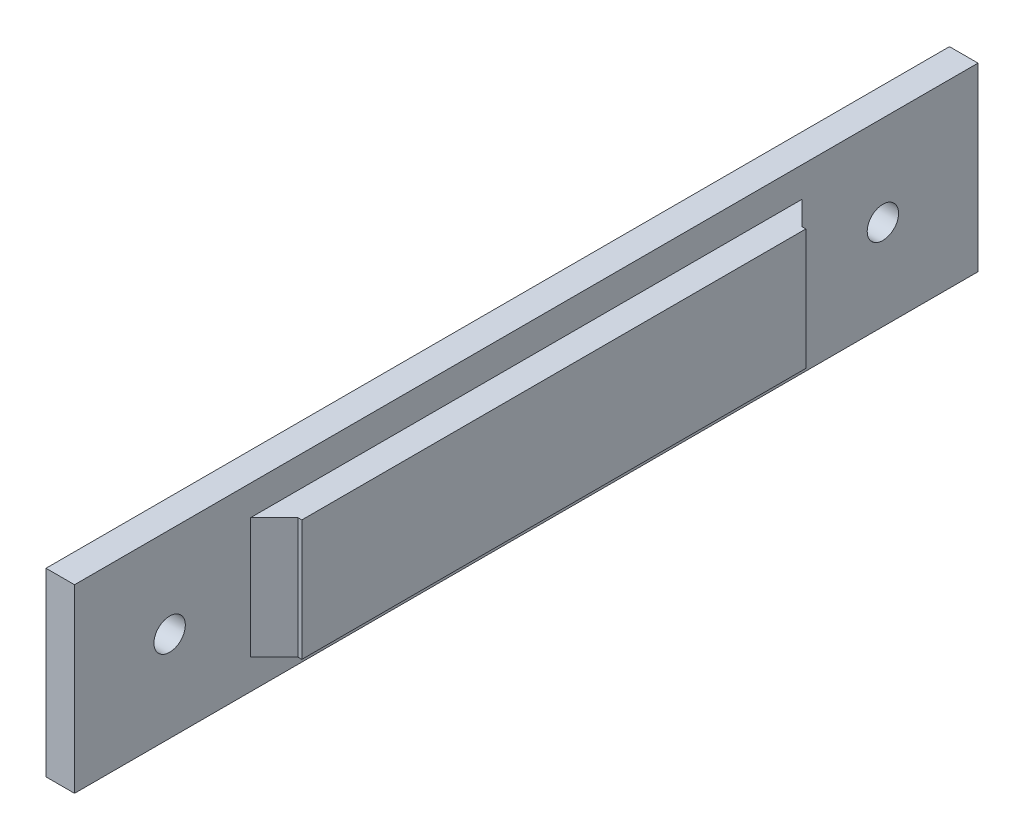
ISO-10303-21;
HEADER;
FILE_DESCRIPTION(('STEP AP214'),'2;1');
FILE_NAME('part.step','',(''),(''),'','','');
FILE_SCHEMA(('AUTOMOTIVE_DESIGN { 1 0 10303 214 1 1 1 1 }'));
ENDSEC;
DATA;
#1=APPLICATION_CONTEXT('core data for automotive mechanical design processes');
#2=APPLICATION_PROTOCOL_DEFINITION('international standard','automotive_design',2000,#1);
#3=PRODUCT_CONTEXT('',#1,'mechanical');
#4=PRODUCT('Part','Part','',(#3));
#5=PRODUCT_RELATED_PRODUCT_CATEGORY('part','',(#4));
#6=PRODUCT_DEFINITION_FORMATION('','',#4);
#7=PRODUCT_DEFINITION_CONTEXT('part definition',#1,'design');
#8=PRODUCT_DEFINITION('design','',#6,#7);
#9=PRODUCT_DEFINITION_SHAPE('','',#8);
#10=(LENGTH_UNIT() NAMED_UNIT(*) SI_UNIT(.MILLI.,.METRE.));
#11=(NAMED_UNIT(*) PLANE_ANGLE_UNIT() SI_UNIT($,.RADIAN.));
#12=(NAMED_UNIT(*) SI_UNIT($,.STERADIAN.) SOLID_ANGLE_UNIT());
#13=UNCERTAINTY_MEASURE_WITH_UNIT(LENGTH_MEASURE(1.E-05),#10,'distance_accuracy_value','');
#14=(GEOMETRIC_REPRESENTATION_CONTEXT(3) GLOBAL_UNCERTAINTY_ASSIGNED_CONTEXT((#13)) GLOBAL_UNIT_ASSIGNED_CONTEXT((#10,
#11,#12)) REPRESENTATION_CONTEXT('',''));
#15=CARTESIAN_POINT('',(0.,0.,0.));
#16=DIRECTION('',(0.,0.,1.));
#17=DIRECTION('',(1.,0.,0.));
#18=AXIS2_PLACEMENT_3D('',#15,#16,#17);
#19=CARTESIAN_POINT('',(0.,0.,95.));
#20=DIRECTION('',(0.,0.,1.));
#21=DIRECTION('',(1.,0.,0.));
#22=AXIS2_PLACEMENT_3D('',#19,#20,#21);
#23=PLANE('',#22);
#24=DIRECTION('',(1.,0.,0.));
#25=VECTOR('',#24,1.);
#26=CARTESIAN_POINT('',(0.,-3.,95.));
#27=LINE('',#26,#25);
#28=CARTESIAN_POINT('',(-3.,-3.,95.));
#29=VERTEX_POINT('',#28);
#30=CARTESIAN_POINT('',(0.,-3.,95.));
#31=VERTEX_POINT('',#30);
#32=EDGE_CURVE('E192',#29,#31,#27,.T.);
#33=ORIENTED_EDGE('',*,*,#32,.T.);
#34=DIRECTION('',(0.,-1.,0.));
#35=VECTOR('',#34,1.);
#36=CARTESIAN_POINT('',(0.,0.,95.));
#37=LINE('',#36,#35);
#38=CARTESIAN_POINT('',(0.,16.,95.));
#39=VERTEX_POINT('',#38);
#40=EDGE_CURVE('E185',#39,#31,#37,.T.);
#41=ORIENTED_EDGE('',*,*,#40,.F.);
#42=DIRECTION('',(-1.,0.,0.));
#43=VECTOR('',#42,1.);
#44=CARTESIAN_POINT('',(0.,16.,95.));
#45=LINE('',#44,#43);
#46=CARTESIAN_POINT('',(-3.,16.,95.));
#47=VERTEX_POINT('',#46);
#48=EDGE_CURVE('E196',#39,#47,#45,.T.);
#49=ORIENTED_EDGE('',*,*,#48,.T.);
#50=DIRECTION('',(0.,-1.,0.));
#51=VECTOR('',#50,1.);
#52=CARTESIAN_POINT('',(-3.,0.,95.));
#53=LINE('',#52,#51);
#54=EDGE_CURVE('E189',#47,#29,#53,.T.);
#55=ORIENTED_EDGE('',*,*,#54,.T.);
#56=EDGE_LOOP('',(#33,#41,#49,#55));
#57=FACE_BOUND('',#56,.T.);
#58=ADVANCED_FACE('F62',(#57),#23,.T.);
#59=CARTESIAN_POINT('',(0.,0.,0.));
#60=DIRECTION('',(0.,0.,1.));
#61=DIRECTION('',(1.,0.,0.));
#62=AXIS2_PLACEMENT_3D('',#59,#60,#61);
#63=PLANE('',#62);
#64=DIRECTION('',(0.,-1.,0.));
#65=VECTOR('',#64,1.);
#66=CARTESIAN_POINT('',(0.,0.,0.));
#67=LINE('',#66,#65);
#68=CARTESIAN_POINT('',(0.,16.,0.));
#69=VERTEX_POINT('',#68);
#70=CARTESIAN_POINT('',(0.,-3.,0.));
#71=VERTEX_POINT('',#70);
#72=EDGE_CURVE('E184',#69,#71,#67,.T.);
#73=ORIENTED_EDGE('',*,*,#72,.T.);
#74=DIRECTION('',(1.,0.,0.));
#75=VECTOR('',#74,1.);
#76=CARTESIAN_POINT('',(0.,-3.,0.));
#77=LINE('',#76,#75);
#78=CARTESIAN_POINT('',(-3.,-3.,0.));
#79=VERTEX_POINT('',#78);
#80=EDGE_CURVE('E201',#79,#71,#77,.T.);
#81=ORIENTED_EDGE('',*,*,#80,.F.);
#82=DIRECTION('',(0.,-1.,0.));
#83=VECTOR('',#82,1.);
#84=CARTESIAN_POINT('',(-3.,0.,0.));
#85=LINE('',#84,#83);
#86=CARTESIAN_POINT('',(-3.,16.,0.));
#87=VERTEX_POINT('',#86);
#88=EDGE_CURVE('E187',#87,#79,#85,.T.);
#89=ORIENTED_EDGE('',*,*,#88,.F.);
#90=DIRECTION('',(-1.,0.,0.));
#91=VECTOR('',#90,1.);
#92=CARTESIAN_POINT('',(0.,16.,0.));
#93=LINE('',#92,#91);
#94=EDGE_CURVE('E193',#69,#87,#93,.T.);
#95=ORIENTED_EDGE('',*,*,#94,.F.);
#96=EDGE_LOOP('',(#73,#81,#89,#95));
#97=FACE_BOUND('',#96,.T.);
#98=ADVANCED_FACE('F253',(#97),#63,.F.);
#99=CARTESIAN_POINT('',(0.,-3.,95.));
#100=DIRECTION('',(0.,1.,0.));
#101=DIRECTION('',(0.,0.,1.));
#102=AXIS2_PLACEMENT_3D('',#99,#100,#101);
#103=PLANE('',#102);
#104=DIRECTION('',(0.,0.,-1.));
#105=VECTOR('',#104,1.);
#106=CARTESIAN_POINT('',(0.,-3.,95.));
#107=LINE('',#106,#105);
#108=EDGE_CURVE('E161',#31,#71,#107,.T.);
#109=ORIENTED_EDGE('',*,*,#108,.F.);
#110=ORIENTED_EDGE('',*,*,#32,.F.);
#111=DIRECTION('',(0.,0.,-1.));
#112=VECTOR('',#111,1.);
#113=CARTESIAN_POINT('',(-3.,-3.,95.));
#114=LINE('',#113,#112);
#115=EDGE_CURVE('E207',#29,#79,#114,.T.);
#116=ORIENTED_EDGE('',*,*,#115,.T.);
#117=ORIENTED_EDGE('',*,*,#80,.T.);
#118=EDGE_LOOP('',(#109,#110,#116,#117));
#119=FACE_BOUND('',#118,.T.);
#120=ADVANCED_FACE('F259',(#119),#103,.F.);
#121=CARTESIAN_POINT('',(0.,16.,95.));
#122=DIRECTION('',(0.,-1.,0.));
#123=DIRECTION('',(0.,0.,-1.));
#124=AXIS2_PLACEMENT_3D('',#121,#122,#123);
#125=PLANE('',#124);
#126=DIRECTION('',(0.,0.,1.));
#127=VECTOR('',#126,1.);
#128=CARTESIAN_POINT('',(0.,16.,95.));
#129=LINE('',#128,#127);
#130=EDGE_CURVE('E164',#69,#39,#129,.T.);
#131=ORIENTED_EDGE('',*,*,#130,.F.);
#132=ORIENTED_EDGE('',*,*,#94,.T.);
#133=DIRECTION('',(0.,0.,-1.));
#134=VECTOR('',#133,1.);
#135=CARTESIAN_POINT('',(-3.,16.,95.));
#136=LINE('',#135,#134);
#137=EDGE_CURVE('E198',#47,#87,#136,.T.);
#138=ORIENTED_EDGE('',*,*,#137,.F.);
#139=ORIENTED_EDGE('',*,*,#48,.F.);
#140=EDGE_LOOP('',(#131,#132,#138,#139));
#141=FACE_BOUND('',#140,.T.);
#142=ADVANCED_FACE('F265',(#141),#125,.F.);
#143=CARTESIAN_POINT('',(-3.,0.,95.));
#144=DIRECTION('',(1.,0.,0.));
#145=DIRECTION('',(0.,0.,-1.));
#146=AXIS2_PLACEMENT_3D('',#143,#144,#145);
#147=PLANE('',#146);
#148=CARTESIAN_POINT('',(-3.,6.5,10.));
#149=DIRECTION('',(-1.,0.,0.));
#150=DIRECTION('',(0.,0.,1.));
#151=AXIS2_PLACEMENT_3D('',#148,#149,#150);
#152=CIRCLE('',#151,1.65);
#153=CARTESIAN_POINT('',(-3.,6.5,11.65));
#154=VERTEX_POINT('',#153);
#155=EDGE_CURVE('E173',#154,#154,#152,.T.);
#156=ORIENTED_EDGE('',*,*,#155,.F.);
#157=EDGE_LOOP('',(#156));
#158=FACE_BOUND('',#157,.T.);
#159=CARTESIAN_POINT('',(-3.,6.5,85.));
#160=DIRECTION('',(-1.,0.,0.));
#161=DIRECTION('',(0.,0.,1.));
#162=AXIS2_PLACEMENT_3D('',#159,#160,#161);
#163=CIRCLE('',#162,1.65);
#164=CARTESIAN_POINT('',(-3.,6.5,86.65));
#165=VERTEX_POINT('',#164);
#166=EDGE_CURVE('E172',#165,#165,#163,.T.);
#167=ORIENTED_EDGE('',*,*,#166,.F.);
#168=EDGE_LOOP('',(#167));
#169=FACE_BOUND('',#168,.T.);
#170=ORIENTED_EDGE('',*,*,#88,.T.);
#171=ORIENTED_EDGE('',*,*,#115,.F.);
#172=ORIENTED_EDGE('',*,*,#54,.F.);
#173=ORIENTED_EDGE('',*,*,#137,.T.);
#174=EDGE_LOOP('',(#170,#171,#172,#173));
#175=FACE_BOUND('',#174,.T.);
#176=ADVANCED_FACE('F268',(#158,#169,#175),#147,.F.);
#177=CARTESIAN_POINT('',(0.,0.,95.));
#178=DIRECTION('',(1.,0.,0.));
#179=DIRECTION('',(0.,0.,-1.));
#180=AXIS2_PLACEMENT_3D('',#177,#178,#179);
#181=PLANE('',#180);
#182=DIRECTION('',(0.,0.,1.));
#183=VECTOR('',#182,1.);
#184=CARTESIAN_POINT('',(0.,12.85,74.));
#185=LINE('',#184,#183);
#186=CARTESIAN_POINT('',(0.,12.85,18.5));
#187=VERTEX_POINT('',#186);
#188=CARTESIAN_POINT('',(0.,12.85,76.5));
#189=VERTEX_POINT('',#188);
#190=EDGE_CURVE('E157',#187,#189,#185,.T.);
#191=ORIENTED_EDGE('',*,*,#190,.F.);
#192=DIRECTION('',(0.,-1.,0.));
#193=VECTOR('',#192,1.);
#194=CARTESIAN_POINT('',(0.,0.,18.5));
#195=LINE('',#194,#193);
#196=CARTESIAN_POINT('',(0.,0.150000000000021,18.5));
#197=VERTEX_POINT('',#196);
#198=EDGE_CURVE('E216',#187,#197,#195,.T.);
#199=ORIENTED_EDGE('',*,*,#198,.T.);
#200=DIRECTION('',(0.,0.,-1.));
#201=VECTOR('',#200,1.);
#202=CARTESIAN_POINT('',(0.,0.149999999999985,74.));
#203=LINE('',#202,#201);
#204=CARTESIAN_POINT('',(0.,0.149999999999983,76.5));
#205=VERTEX_POINT('',#204);
#206=EDGE_CURVE('E224',#205,#197,#203,.T.);
#207=ORIENTED_EDGE('',*,*,#206,.F.);
#208=DIRECTION('',(0.,1.,0.));
#209=VECTOR('',#208,1.);
#210=CARTESIAN_POINT('',(0.,0.,76.5));
#211=LINE('',#210,#209);
#212=EDGE_CURVE('E213',#205,#189,#211,.T.);
#213=ORIENTED_EDGE('',*,*,#212,.T.);
#214=EDGE_LOOP('',(#191,#199,#207,#213));
#215=FACE_BOUND('',#214,.T.);
#216=CARTESIAN_POINT('',(0.,6.5,10.));
#217=DIRECTION('',(1.,0.,0.));
#218=DIRECTION('',(0.,0.,-1.));
#219=AXIS2_PLACEMENT_3D('',#216,#217,#218);
#220=CIRCLE('',#219,1.65);
#221=CARTESIAN_POINT('',(0.,6.5,11.65));
#222=VERTEX_POINT('',#221);
#223=EDGE_CURVE('E181',#222,#222,#220,.T.);
#224=ORIENTED_EDGE('',*,*,#223,.F.);
#225=EDGE_LOOP('',(#224));
#226=FACE_BOUND('',#225,.T.);
#227=CARTESIAN_POINT('',(0.,6.5,85.));
#228=DIRECTION('',(1.,0.,0.));
#229=DIRECTION('',(0.,0.,-1.));
#230=AXIS2_PLACEMENT_3D('',#227,#228,#229);
#231=CIRCLE('',#230,1.65);
#232=CARTESIAN_POINT('',(0.,6.5,86.65));
#233=VERTEX_POINT('',#232);
#234=EDGE_CURVE('E176',#233,#233,#231,.T.);
#235=ORIENTED_EDGE('',*,*,#234,.F.);
#236=EDGE_LOOP('',(#235));
#237=FACE_BOUND('',#236,.T.);
#238=ORIENTED_EDGE('',*,*,#72,.F.);
#239=ORIENTED_EDGE('',*,*,#130,.T.);
#240=ORIENTED_EDGE('',*,*,#40,.T.);
#241=ORIENTED_EDGE('',*,*,#108,.T.);
#242=EDGE_LOOP('',(#238,#239,#240,#241));
#243=FACE_BOUND('',#242,.T.);
#244=ADVANCED_FACE('F226',(#215,#226,#237,#243),#181,.T.);
#245=CARTESIAN_POINT('',(27.,6.5,85.));
#246=DIRECTION('',(-1.,0.,0.));
#247=DIRECTION('',(0.,0.,1.));
#248=AXIS2_PLACEMENT_3D('',#245,#246,#247);
#249=CYLINDRICAL_SURFACE('',#248,1.65);
#250=CARTESIAN_POINT('',(0.,6.5,86.65));
#251=CARTESIAN_POINT('',(-0.0312500000000035,6.5,86.65));
#252=CARTESIAN_POINT('',(-0.0625000000000035,6.5,86.65));
#253=CARTESIAN_POINT('',(-0.125000000000004,6.5,86.65));
#254=CARTESIAN_POINT('',(-0.156250000000004,6.5,86.65));
#255=CARTESIAN_POINT('',(-0.218750000000004,6.5,86.65));
#256=CARTESIAN_POINT('',(-0.250000000000004,6.5,86.65));
#257=CARTESIAN_POINT('',(-0.312500000000004,6.5,86.65));
#258=CARTESIAN_POINT('',(-0.343750000000004,6.5,86.65));
#259=CARTESIAN_POINT('',(-0.406250000000004,6.5,86.65));
#260=CARTESIAN_POINT('',(-0.437500000000004,6.5,86.65));
#261=CARTESIAN_POINT('',(-0.500000000000004,6.5,86.65));
#262=CARTESIAN_POINT('',(-0.531250000000004,6.5,86.65));
#263=CARTESIAN_POINT('',(-0.593750000000004,6.5,86.65));
#264=CARTESIAN_POINT('',(-0.625000000000004,6.5,86.65));
#265=CARTESIAN_POINT('',(-0.687500000000004,6.5,86.65));
#266=CARTESIAN_POINT('',(-0.718750000000004,6.5,86.65));
#267=CARTESIAN_POINT('',(-0.781250000000003,6.5,86.65));
#268=CARTESIAN_POINT('',(-0.812500000000002,6.5,86.65));
#269=CARTESIAN_POINT('',(-0.875000000000001,6.5,86.65));
#270=CARTESIAN_POINT('',(-0.906250000000001,6.5,86.65));
#271=CARTESIAN_POINT('',(-0.968750000000001,6.5,86.65));
#272=CARTESIAN_POINT('',(-1.,6.5,86.65));
#273=CARTESIAN_POINT('',(-1.0625,6.5,86.65));
#274=CARTESIAN_POINT('',(-1.09375,6.5,86.65));
#275=CARTESIAN_POINT('',(-1.15625,6.5,86.65));
#276=CARTESIAN_POINT('',(-1.1875,6.5,86.65));
#277=CARTESIAN_POINT('',(-1.25,6.5,86.65));
#278=CARTESIAN_POINT('',(-1.28125,6.5,86.65));
#279=CARTESIAN_POINT('',(-1.34375,6.5,86.65));
#280=CARTESIAN_POINT('',(-1.375,6.5,86.65));
#281=CARTESIAN_POINT('',(-1.4375,6.5,86.65));
#282=CARTESIAN_POINT('',(-1.46875,6.5,86.65));
#283=CARTESIAN_POINT('',(-1.53125,6.5,86.65));
#284=CARTESIAN_POINT('',(-1.5625,6.5,86.65));
#285=CARTESIAN_POINT('',(-1.625,6.5,86.65));
#286=CARTESIAN_POINT('',(-1.65625,6.5,86.65));
#287=CARTESIAN_POINT('',(-1.71875,6.5,86.65));
#288=CARTESIAN_POINT('',(-1.75,6.5,86.65));
#289=CARTESIAN_POINT('',(-1.8125,6.5,86.65));
#290=CARTESIAN_POINT('',(-1.84375,6.5,86.65));
#291=CARTESIAN_POINT('',(-1.90625,6.5,86.65));
#292=CARTESIAN_POINT('',(-1.9375,6.5,86.65));
#293=CARTESIAN_POINT('',(-2.,6.5,86.65));
#294=CARTESIAN_POINT('',(-2.03125,6.5,86.65));
#295=CARTESIAN_POINT('',(-2.09375,6.5,86.65));
#296=CARTESIAN_POINT('',(-2.125,6.5,86.65));
#297=CARTESIAN_POINT('',(-2.1875,6.5,86.65));
#298=CARTESIAN_POINT('',(-2.21875,6.5,86.65));
#299=CARTESIAN_POINT('',(-2.28125,6.5,86.65));
#300=CARTESIAN_POINT('',(-2.3125,6.5,86.65));
#301=CARTESIAN_POINT('',(-2.375,6.5,86.65));
#302=CARTESIAN_POINT('',(-2.40625,6.5,86.65));
#303=CARTESIAN_POINT('',(-2.46875,6.5,86.65));
#304=CARTESIAN_POINT('',(-2.5,6.5,86.65));
#305=CARTESIAN_POINT('',(-2.5625,6.5,86.65));
#306=CARTESIAN_POINT('',(-2.59375,6.5,86.65));
#307=CARTESIAN_POINT('',(-2.65625,6.5,86.65));
#308=CARTESIAN_POINT('',(-2.6875,6.5,86.65));
#309=CARTESIAN_POINT('',(-2.75,6.5,86.65));
#310=CARTESIAN_POINT('',(-2.78125,6.5,86.65));
#311=CARTESIAN_POINT('',(-2.84375,6.5,86.65));
#312=CARTESIAN_POINT('',(-2.875,6.5,86.65));
#313=CARTESIAN_POINT('',(-2.9375,6.5,86.65));
#314=CARTESIAN_POINT('',(-2.96875,6.5,86.65));
#315=CARTESIAN_POINT('',(-3.,6.5,86.65));
#316=B_SPLINE_CURVE_WITH_KNOTS('',3,(#250,#251,#252,#253,#254,#255,#256,#257,#258,#259,#260,
#261,#262,#263,#264,#265,#266,#267,#268,#269,#270,#271,#272,#273,#274,#275,#276,#277,#278,#279,
#280,#281,#282,#283,#284,#285,#286,#287,#288,#289,#290,#291,#292,#293,#294,#295,#296,#297,#298,
#299,#300,#301,#302,#303,#304,#305,#306,#307,#308,#309,#310,#311,#312,#313,#314,#315),
.UNSPECIFIED.,.F.,.F.,(4,2,2,2,2,2,2,2,2,2,2,2,2,2,2,2,2,2,2,2,2,2,2,2,2,2,2,2,2,2,2,2,4),(0.,
0.0937500000000001,0.1875,0.28125,0.375,0.46875,0.5625,0.656250000000001,0.750000000000001,
0.843749999999997,0.937499999999997,1.03125,1.125,1.21875,1.3125,1.40625,1.5,1.59375,1.6875,
1.78125,1.875,1.96875,2.0625,2.15625,2.25,2.34375,2.4375,2.53125,2.625,2.71875,2.8125,2.90625,
3.),.UNSPECIFIED.);
#317=EDGE_CURVE('BSEAM277',#233,#165,#316,.T.);
#318=ORIENTED_EDGE('',*,*,#234,.T.);
#319=ORIENTED_EDGE('',*,*,#166,.T.);
#320=ORIENTED_EDGE('',*,*,#317,.T.);
#321=ORIENTED_EDGE('',*,*,#317,.F.);
#322=EDGE_LOOP('',(#318,#320,#319,#321));
#323=FACE_BOUND('',#322,.T.);
#324=ADVANCED_FACE('F277',(#323),#249,.F.);
#325=CARTESIAN_POINT('',(27.,6.5,10.));
#326=DIRECTION('',(-1.,0.,0.));
#327=DIRECTION('',(0.,0.,1.));
#328=AXIS2_PLACEMENT_3D('',#325,#326,#327);
#329=CYLINDRICAL_SURFACE('',#328,1.65);
#330=CARTESIAN_POINT('',(0.,6.5,11.65));
#331=CARTESIAN_POINT('',(-0.0312500000000035,6.5,11.65));
#332=CARTESIAN_POINT('',(-0.0625000000000035,6.5,11.65));
#333=CARTESIAN_POINT('',(-0.125000000000004,6.5,11.65));
#334=CARTESIAN_POINT('',(-0.156250000000004,6.5,11.65));
#335=CARTESIAN_POINT('',(-0.218750000000004,6.5,11.65));
#336=CARTESIAN_POINT('',(-0.250000000000004,6.5,11.65));
#337=CARTESIAN_POINT('',(-0.312500000000004,6.5,11.65));
#338=CARTESIAN_POINT('',(-0.343750000000004,6.5,11.65));
#339=CARTESIAN_POINT('',(-0.406250000000004,6.5,11.65));
#340=CARTESIAN_POINT('',(-0.437500000000004,6.5,11.65));
#341=CARTESIAN_POINT('',(-0.500000000000004,6.5,11.65));
#342=CARTESIAN_POINT('',(-0.531250000000004,6.5,11.65));
#343=CARTESIAN_POINT('',(-0.593750000000004,6.5,11.65));
#344=CARTESIAN_POINT('',(-0.625000000000004,6.5,11.65));
#345=CARTESIAN_POINT('',(-0.687500000000004,6.5,11.65));
#346=CARTESIAN_POINT('',(-0.718750000000004,6.5,11.65));
#347=CARTESIAN_POINT('',(-0.781250000000003,6.5,11.65));
#348=CARTESIAN_POINT('',(-0.812500000000002,6.5,11.65));
#349=CARTESIAN_POINT('',(-0.875000000000001,6.5,11.65));
#350=CARTESIAN_POINT('',(-0.906250000000001,6.5,11.65));
#351=CARTESIAN_POINT('',(-0.968750000000001,6.5,11.65));
#352=CARTESIAN_POINT('',(-1.,6.5,11.65));
#353=CARTESIAN_POINT('',(-1.0625,6.5,11.65));
#354=CARTESIAN_POINT('',(-1.09375,6.5,11.65));
#355=CARTESIAN_POINT('',(-1.15625,6.5,11.65));
#356=CARTESIAN_POINT('',(-1.1875,6.5,11.65));
#357=CARTESIAN_POINT('',(-1.25,6.5,11.65));
#358=CARTESIAN_POINT('',(-1.28125,6.5,11.65));
#359=CARTESIAN_POINT('',(-1.34375,6.5,11.65));
#360=CARTESIAN_POINT('',(-1.375,6.5,11.65));
#361=CARTESIAN_POINT('',(-1.4375,6.5,11.65));
#362=CARTESIAN_POINT('',(-1.46875,6.5,11.65));
#363=CARTESIAN_POINT('',(-1.53125,6.5,11.65));
#364=CARTESIAN_POINT('',(-1.5625,6.5,11.65));
#365=CARTESIAN_POINT('',(-1.625,6.5,11.65));
#366=CARTESIAN_POINT('',(-1.65625,6.5,11.65));
#367=CARTESIAN_POINT('',(-1.71875,6.5,11.65));
#368=CARTESIAN_POINT('',(-1.75,6.5,11.65));
#369=CARTESIAN_POINT('',(-1.8125,6.5,11.65));
#370=CARTESIAN_POINT('',(-1.84375,6.5,11.65));
#371=CARTESIAN_POINT('',(-1.90625,6.5,11.65));
#372=CARTESIAN_POINT('',(-1.9375,6.5,11.65));
#373=CARTESIAN_POINT('',(-2.,6.5,11.65));
#374=CARTESIAN_POINT('',(-2.03125,6.5,11.65));
#375=CARTESIAN_POINT('',(-2.09375,6.5,11.65));
#376=CARTESIAN_POINT('',(-2.125,6.5,11.65));
#377=CARTESIAN_POINT('',(-2.1875,6.5,11.65));
#378=CARTESIAN_POINT('',(-2.21875,6.5,11.65));
#379=CARTESIAN_POINT('',(-2.28125,6.5,11.65));
#380=CARTESIAN_POINT('',(-2.3125,6.5,11.65));
#381=CARTESIAN_POINT('',(-2.375,6.5,11.65));
#382=CARTESIAN_POINT('',(-2.40625,6.5,11.65));
#383=CARTESIAN_POINT('',(-2.46875,6.5,11.65));
#384=CARTESIAN_POINT('',(-2.5,6.5,11.65));
#385=CARTESIAN_POINT('',(-2.5625,6.5,11.65));
#386=CARTESIAN_POINT('',(-2.59375,6.5,11.65));
#387=CARTESIAN_POINT('',(-2.65625,6.5,11.65));
#388=CARTESIAN_POINT('',(-2.6875,6.5,11.65));
#389=CARTESIAN_POINT('',(-2.75,6.5,11.65));
#390=CARTESIAN_POINT('',(-2.78125,6.5,11.65));
#391=CARTESIAN_POINT('',(-2.84375,6.5,11.65));
#392=CARTESIAN_POINT('',(-2.875,6.5,11.65));
#393=CARTESIAN_POINT('',(-2.9375,6.5,11.65));
#394=CARTESIAN_POINT('',(-2.96875,6.5,11.65));
#395=CARTESIAN_POINT('',(-3.,6.5,11.65));
#396=B_SPLINE_CURVE_WITH_KNOTS('',3,(#330,#331,#332,#333,#334,#335,#336,#337,#338,#339,#340,
#341,#342,#343,#344,#345,#346,#347,#348,#349,#350,#351,#352,#353,#354,#355,#356,#357,#358,#359,
#360,#361,#362,#363,#364,#365,#366,#367,#368,#369,#370,#371,#372,#373,#374,#375,#376,#377,#378,
#379,#380,#381,#382,#383,#384,#385,#386,#387,#388,#389,#390,#391,#392,#393,#394,#395),
.UNSPECIFIED.,.F.,.F.,(4,2,2,2,2,2,2,2,2,2,2,2,2,2,2,2,2,2,2,2,2,2,2,2,2,2,2,2,2,2,2,2,4),(0.,
0.0937500000000001,0.1875,0.28125,0.375,0.46875,0.5625,0.656250000000001,0.750000000000001,
0.843749999999997,0.937499999999997,1.03125,1.125,1.21875,1.3125,1.40625,1.5,1.59375,1.6875,
1.78125,1.875,1.96875,2.0625,2.15625,2.25,2.34375,2.4375,2.53125,2.625,2.71875,2.8125,2.90625,
3.),.UNSPECIFIED.);
#397=EDGE_CURVE('BSEAM293',#222,#154,#396,.T.);
#398=ORIENTED_EDGE('',*,*,#223,.T.);
#399=ORIENTED_EDGE('',*,*,#155,.T.);
#400=ORIENTED_EDGE('',*,*,#397,.T.);
#401=ORIENTED_EDGE('',*,*,#397,.F.);
#402=EDGE_LOOP('',(#398,#400,#399,#401));
#403=FACE_BOUND('',#402,.T.);
#404=ADVANCED_FACE('F293',(#403),#329,.F.);
#405=CARTESIAN_POINT('',(2.9,12.85,74.));
#406=DIRECTION('',(0.,0.,-1.));
#407=DIRECTION('',(-1.,0.,0.));
#408=AXIS2_PLACEMENT_3D('',#405,#406,#407);
#409=PLANE('',#408);
#410=DIRECTION('',(-1.,0.,0.));
#411=VECTOR('',#410,1.);
#412=CARTESIAN_POINT('',(2.9,12.85,74.));
#413=LINE('',#412,#411);
#414=CARTESIAN_POINT('',(2.9,12.85,74.));
#415=VERTEX_POINT('',#414);
#416=CARTESIAN_POINT('',(2.50000000000003,12.85,74.));
#417=VERTEX_POINT('',#416);
#418=EDGE_CURVE('E235',#415,#417,#413,.T.);
#419=ORIENTED_EDGE('',*,*,#418,.T.);
#420=DIRECTION('',(0.,-1.,0.));
#421=VECTOR('',#420,1.);
#422=CARTESIAN_POINT('',(2.50000000000003,12.85,74.));
#423=LINE('',#422,#421);
#424=CARTESIAN_POINT('',(2.50000000000003,0.149999999999985,74.));
#425=VERTEX_POINT('',#424);
#426=EDGE_CURVE('E160',#417,#425,#423,.T.);
#427=ORIENTED_EDGE('',*,*,#426,.T.);
#428=DIRECTION('',(-1.,0.,0.));
#429=VECTOR('',#428,1.);
#430=CARTESIAN_POINT('',(2.9,0.149999999999985,74.));
#431=LINE('',#430,#429);
#432=CARTESIAN_POINT('',(2.9,0.149999999999985,74.));
#433=VERTEX_POINT('',#432);
#434=EDGE_CURVE('E144',#433,#425,#431,.T.);
#435=ORIENTED_EDGE('',*,*,#434,.F.);
#436=DIRECTION('',(0.,-1.,0.));
#437=VECTOR('',#436,1.);
#438=CARTESIAN_POINT('',(2.9,12.85,74.));
#439=LINE('',#438,#437);
#440=EDGE_CURVE('E150',#415,#433,#439,.T.);
#441=ORIENTED_EDGE('',*,*,#440,.F.);
#442=EDGE_LOOP('',(#419,#427,#435,#441));
#443=FACE_BOUND('',#442,.T.);
#444=ADVANCED_FACE('F159',(#443),#409,.F.);
#445=CARTESIAN_POINT('',(2.9,0.149999999999985,74.));
#446=DIRECTION('',(0.,1.,0.));
#447=DIRECTION('',(0.,0.,1.));
#448=AXIS2_PLACEMENT_3D('',#445,#446,#447);
#449=PLANE('',#448);
#450=ORIENTED_EDGE('',*,*,#206,.T.);
#451=DIRECTION('',(0.707106781186553,0.,0.707106781186542));
#452=VECTOR('',#451,1.);
#453=CARTESIAN_POINT('',(29.2,0.150000000000002,47.6999999999996));
#454=LINE('',#453,#452);
#455=CARTESIAN_POINT('',(2.50000000000003,0.150000000000019,21.));
#456=VERTEX_POINT('',#455);
#457=EDGE_CURVE('E223',#197,#456,#454,.T.);
#458=ORIENTED_EDGE('',*,*,#457,.T.);
#459=DIRECTION('',(-1.,0.,0.));
#460=VECTOR('',#459,1.);
#461=CARTESIAN_POINT('',(2.9,0.150000000000019,21.));
#462=LINE('',#461,#460);
#463=CARTESIAN_POINT('',(2.9,0.150000000000019,21.));
#464=VERTEX_POINT('',#463);
#465=EDGE_CURVE('E146',#464,#456,#462,.T.);
#466=ORIENTED_EDGE('',*,*,#465,.F.);
#467=DIRECTION('',(0.,0.,-1.));
#468=VECTOR('',#467,1.);
#469=CARTESIAN_POINT('',(2.9,0.149999999999985,74.));
#470=LINE('',#469,#468);
#471=EDGE_CURVE('E140',#433,#464,#470,.T.);
#472=ORIENTED_EDGE('',*,*,#471,.F.);
#473=ORIENTED_EDGE('',*,*,#434,.T.);
#474=DIRECTION('',(-0.707106781186551,0.,0.707106781186544));
#475=VECTOR('',#474,1.);
#476=CARTESIAN_POINT('',(2.70000000000002,0.149999999999985,73.8));
#477=LINE('',#476,#475);
#478=EDGE_CURVE('E71',#425,#205,#477,.T.);
#479=ORIENTED_EDGE('',*,*,#478,.T.);
#480=EDGE_LOOP('',(#450,#458,#466,#472,#473,#479));
#481=FACE_BOUND('',#480,.T.);
#482=ADVANCED_FACE('F142',(#481),#449,.F.);
#483=CARTESIAN_POINT('',(2.9,12.85,21.));
#484=DIRECTION('',(0.,0.,1.));
#485=DIRECTION('',(0.,-1.,0.));
#486=AXIS2_PLACEMENT_3D('',#483,#484,#485);
#487=PLANE('',#486);
#488=ORIENTED_EDGE('',*,*,#465,.T.);
#489=DIRECTION('',(0.,1.,0.));
#490=VECTOR('',#489,1.);
#491=CARTESIAN_POINT('',(2.50000000000003,12.85,21.));
#492=LINE('',#491,#490);
#493=CARTESIAN_POINT('',(2.50000000000003,12.85,21.));
#494=VERTEX_POINT('',#493);
#495=EDGE_CURVE('E210',#456,#494,#492,.T.);
#496=ORIENTED_EDGE('',*,*,#495,.T.);
#497=DIRECTION('',(-1.,0.,0.));
#498=VECTOR('',#497,1.);
#499=CARTESIAN_POINT('',(2.9,12.85,21.));
#500=LINE('',#499,#498);
#501=CARTESIAN_POINT('',(2.9,12.85,21.));
#502=VERTEX_POINT('',#501);
#503=EDGE_CURVE('E166',#502,#494,#500,.T.);
#504=ORIENTED_EDGE('',*,*,#503,.F.);
#505=DIRECTION('',(0.,1.,0.));
#506=VECTOR('',#505,1.);
#507=CARTESIAN_POINT('',(2.9,12.85,21.));
#508=LINE('',#507,#506);
#509=EDGE_CURVE('E149',#464,#502,#508,.T.);
#510=ORIENTED_EDGE('',*,*,#509,.F.);
#511=EDGE_LOOP('',(#488,#496,#504,#510));
#512=FACE_BOUND('',#511,.T.);
#513=ADVANCED_FACE('F240',(#512),#487,.F.);
#514=CARTESIAN_POINT('',(2.9,12.85,74.));
#515=DIRECTION('',(0.,-1.,0.));
#516=DIRECTION('',(0.,0.,-1.));
#517=AXIS2_PLACEMENT_3D('',#514,#515,#516);
#518=PLANE('',#517);
#519=ORIENTED_EDGE('',*,*,#190,.T.);
#520=DIRECTION('',(0.707106781186551,0.,-0.707106781186544));
#521=VECTOR('',#520,1.);
#522=CARTESIAN_POINT('',(2.70000000000002,12.85,73.8));
#523=LINE('',#522,#521);
#524=EDGE_CURVE('E12',#189,#417,#523,.T.);
#525=ORIENTED_EDGE('',*,*,#524,.T.);
#526=ORIENTED_EDGE('',*,*,#418,.F.);
#527=DIRECTION('',(0.,0.,1.));
#528=VECTOR('',#527,1.);
#529=CARTESIAN_POINT('',(2.9,12.85,74.));
#530=LINE('',#529,#528);
#531=EDGE_CURVE('E155',#502,#415,#530,.T.);
#532=ORIENTED_EDGE('',*,*,#531,.F.);
#533=ORIENTED_EDGE('',*,*,#503,.T.);
#534=DIRECTION('',(-0.707106781186553,0.,-0.707106781186542));
#535=VECTOR('',#534,1.);
#536=CARTESIAN_POINT('',(29.2,12.85,47.6999999999996));
#537=LINE('',#536,#535);
#538=EDGE_CURVE('E220',#494,#187,#537,.T.);
#539=ORIENTED_EDGE('',*,*,#538,.T.);
#540=EDGE_LOOP('',(#519,#525,#526,#532,#533,#539));
#541=FACE_BOUND('',#540,.T.);
#542=ADVANCED_FACE('F238',(#541),#518,.F.);
#543=CARTESIAN_POINT('',(2.9,0.,0.));
#544=DIRECTION('',(1.,0.,0.));
#545=DIRECTION('',(0.,0.,-1.));
#546=AXIS2_PLACEMENT_3D('',#543,#544,#545);
#547=PLANE('',#546);
#548=ORIENTED_EDGE('',*,*,#440,.T.);
#549=ORIENTED_EDGE('',*,*,#471,.T.);
#550=ORIENTED_EDGE('',*,*,#509,.T.);
#551=ORIENTED_EDGE('',*,*,#531,.T.);
#552=EDGE_LOOP('',(#548,#549,#550,#551));
#553=FACE_BOUND('',#552,.T.);
#554=ADVANCED_FACE('F153',(#553),#547,.T.);
#555=CARTESIAN_POINT('',(2.50000000000003,12.85,21.));
#556=DIRECTION('',(-0.707106781186542,0.,0.707106781186553));
#557=DIRECTION('',(0.,1.,0.));
#558=AXIS2_PLACEMENT_3D('',#555,#556,#557);
#559=PLANE('',#558);
#560=ORIENTED_EDGE('',*,*,#457,.F.);
#561=ORIENTED_EDGE('',*,*,#198,.F.);
#562=ORIENTED_EDGE('',*,*,#538,.F.);
#563=ORIENTED_EDGE('',*,*,#495,.F.);
#564=EDGE_LOOP('',(#560,#561,#562,#563));
#565=FACE_BOUND('',#564,.T.);
#566=ADVANCED_FACE('F243',(#565),#559,.F.);
#567=CARTESIAN_POINT('',(2.50000000000003,12.85,74.));
#568=DIRECTION('',(-0.707106781186544,0.,-0.707106781186551));
#569=DIRECTION('',(0.,-1.,0.));
#570=AXIS2_PLACEMENT_3D('',#567,#568,#569);
#571=PLANE('',#570);
#572=ORIENTED_EDGE('',*,*,#524,.F.);
#573=ORIENTED_EDGE('',*,*,#212,.F.);
#574=ORIENTED_EDGE('',*,*,#478,.F.);
#575=ORIENTED_EDGE('',*,*,#426,.F.);
#576=EDGE_LOOP('',(#572,#573,#574,#575));
#577=FACE_BOUND('',#576,.T.);
#578=ADVANCED_FACE('F65',(#577),#571,.F.);
#579=CLOSED_SHELL('',(#58,#98,#120,#142,#176,#244,#324,#404,#444,#482,#513,#542,#554,#566,#578));
#580=MANIFOLD_SOLID_BREP('B2',#579);
#581=ADVANCED_BREP_SHAPE_REPRESENTATION('',(#18,#580),#14);
#582=SHAPE_DEFINITION_REPRESENTATION(#9,#581);
ENDSEC;
END-ISO-10303-21;
